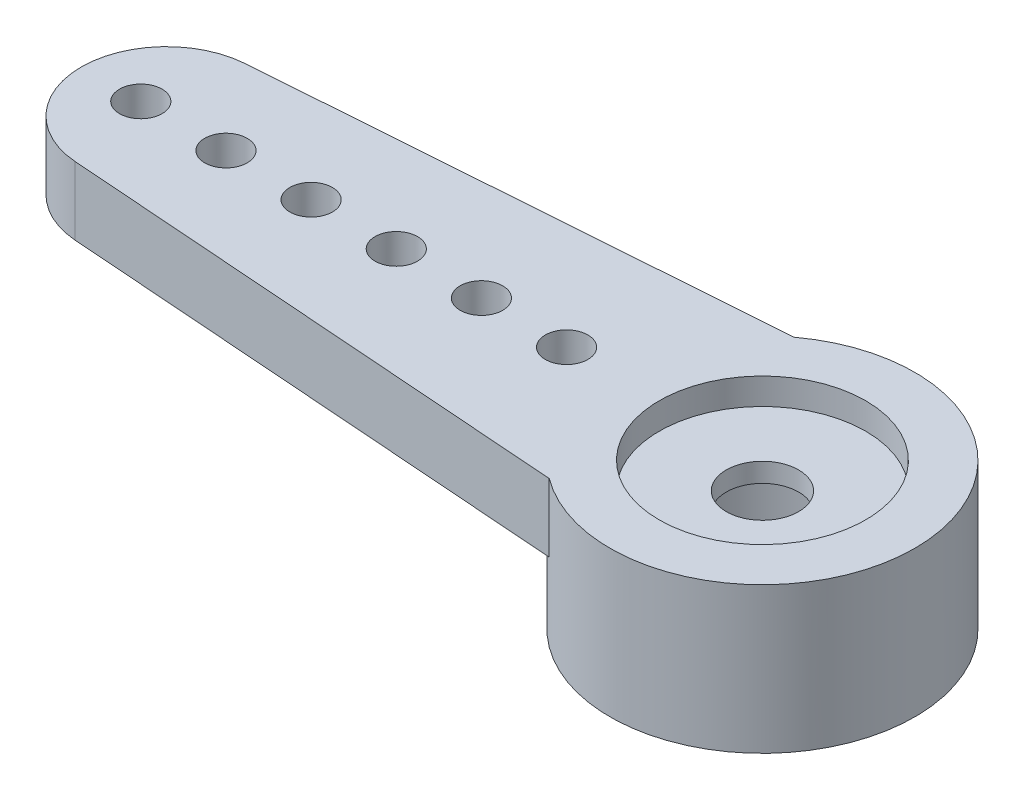
ISO-10303-21;
HEADER;
FILE_DESCRIPTION(('STEP AP214'),'2;1');
FILE_NAME('part.step','',(''),(''),'','','');
FILE_SCHEMA(('AUTOMOTIVE_DESIGN { 1 0 10303 214 1 1 1 1 }'));
ENDSEC;
DATA;
#1=APPLICATION_CONTEXT('core data for automotive mechanical design processes');
#2=APPLICATION_PROTOCOL_DEFINITION('international standard','automotive_design',2000,#1);
#3=PRODUCT_CONTEXT('',#1,'mechanical');
#4=PRODUCT('Part','Part','',(#3));
#5=PRODUCT_RELATED_PRODUCT_CATEGORY('part','',(#4));
#6=PRODUCT_DEFINITION_FORMATION('','',#4);
#7=PRODUCT_DEFINITION_CONTEXT('part definition',#1,'design');
#8=PRODUCT_DEFINITION('design','',#6,#7);
#9=PRODUCT_DEFINITION_SHAPE('','',#8);
#10=(LENGTH_UNIT() NAMED_UNIT(*) SI_UNIT(.MILLI.,.METRE.));
#11=(NAMED_UNIT(*) PLANE_ANGLE_UNIT() SI_UNIT($,.RADIAN.));
#12=(NAMED_UNIT(*) SI_UNIT($,.STERADIAN.) SOLID_ANGLE_UNIT());
#13=UNCERTAINTY_MEASURE_WITH_UNIT(LENGTH_MEASURE(1.E-05),#10,'distance_accuracy_value','');
#14=(GEOMETRIC_REPRESENTATION_CONTEXT(3) GLOBAL_UNCERTAINTY_ASSIGNED_CONTEXT((#13)) GLOBAL_UNIT_ASSIGNED_CONTEXT((#10,
#11,#12)) REPRESENTATION_CONTEXT('',''));
#15=CARTESIAN_POINT('',(0.,0.,0.));
#16=DIRECTION('',(0.,0.,1.));
#17=DIRECTION('',(1.,0.,0.));
#18=AXIS2_PLACEMENT_3D('',#15,#16,#17);
#19=CARTESIAN_POINT('',(5.9,12.67,-5.9));
#20=DIRECTION('',(0.,1.,0.));
#21=DIRECTION('',(0.,0.,1.));
#22=AXIS2_PLACEMENT_3D('',#19,#20,#21);
#23=PLANE('',#22);
#24=CARTESIAN_POINT('',(-2.7,12.67,-5.9));
#25=DIRECTION('',(0.,-1.,0.));
#26=DIRECTION('',(0.,0.,-1.));
#27=AXIS2_PLACEMENT_3D('',#24,#25,#26);
#28=CIRCLE('',#27,0.499999999999988);
#29=CARTESIAN_POINT('',(-2.7,12.67,-6.39999999999999));
#30=VERTEX_POINT('',#29);
#31=EDGE_CURVE('E182',#30,#30,#28,.T.);
#32=ORIENTED_EDGE('',*,*,#31,.F.);
#33=EDGE_LOOP('',(#32));
#34=FACE_BOUND('',#33,.T.);
#35=CARTESIAN_POINT('',(-6.7,12.67,-5.9));
#36=DIRECTION('',(0.,-1.,0.));
#37=DIRECTION('',(0.,0.,-1.));
#38=AXIS2_PLACEMENT_3D('',#35,#36,#37);
#39=CIRCLE('',#38,0.499999999999988);
#40=CARTESIAN_POINT('',(-6.7,12.67,-6.39999999999999));
#41=VERTEX_POINT('',#40);
#42=EDGE_CURVE('E178',#41,#41,#39,.T.);
#43=ORIENTED_EDGE('',*,*,#42,.F.);
#44=EDGE_LOOP('',(#43));
#45=FACE_BOUND('',#44,.T.);
#46=CARTESIAN_POINT('',(-8.7,12.67,-5.9));
#47=DIRECTION('',(0.,-1.,0.));
#48=DIRECTION('',(0.,0.,-1.));
#49=AXIS2_PLACEMENT_3D('',#46,#47,#48);
#50=CIRCLE('',#49,0.499999999999988);
#51=CARTESIAN_POINT('',(-8.7,12.67,-6.39999999999999));
#52=VERTEX_POINT('',#51);
#53=EDGE_CURVE('E174',#52,#52,#50,.T.);
#54=ORIENTED_EDGE('',*,*,#53,.F.);
#55=EDGE_LOOP('',(#54));
#56=FACE_BOUND('',#55,.T.);
#57=CARTESIAN_POINT('',(-0.699999999999997,12.67,-5.9));
#58=DIRECTION('',(0.,-1.,0.));
#59=DIRECTION('',(0.,0.,-1.));
#60=AXIS2_PLACEMENT_3D('',#57,#58,#59);
#61=CIRCLE('',#60,0.499999999999988);
#62=CARTESIAN_POINT('',(-0.699999999999997,12.67,-6.39999999999999));
#63=VERTEX_POINT('',#62);
#64=EDGE_CURVE('E166',#63,#63,#61,.T.);
#65=ORIENTED_EDGE('',*,*,#64,.F.);
#66=EDGE_LOOP('',(#65));
#67=FACE_BOUND('',#66,.T.);
#68=CARTESIAN_POINT('',(1.3,12.67,-5.9));
#69=DIRECTION('',(0.,-1.,0.));
#70=DIRECTION('',(0.,0.,-1.));
#71=AXIS2_PLACEMENT_3D('',#68,#69,#70);
#72=CIRCLE('',#71,0.499999999999988);
#73=CARTESIAN_POINT('',(1.3,12.67,-6.39999999999999));
#74=VERTEX_POINT('',#73);
#75=EDGE_CURVE('E162',#74,#74,#72,.T.);
#76=ORIENTED_EDGE('',*,*,#75,.F.);
#77=EDGE_LOOP('',(#76));
#78=FACE_BOUND('',#77,.T.);
#79=CARTESIAN_POINT('',(5.9,12.67,-5.9));
#80=DIRECTION('',(0.,-1.,0.));
#81=DIRECTION('',(0.,0.,-1.));
#82=AXIS2_PLACEMENT_3D('',#79,#80,#81);
#83=CIRCLE('',#82,3.58);
#84=CARTESIAN_POINT('',(3.76674544416284,12.67,-3.025));
#85=VERTEX_POINT('',#84);
#86=CARTESIAN_POINT('',(3.76674544416284,12.67,-8.775));
#87=VERTEX_POINT('',#86);
#88=EDGE_CURVE('E11',#85,#87,#83,.T.);
#89=ORIENTED_EDGE('',*,*,#88,.F.);
#90=DIRECTION('',(0.997325531387097,0.,0.0730875122264068));
#91=VECTOR('',#90,1.);
#92=CARTESIAN_POINT('',(-8.24617502445281,12.67,-3.90534893722581));
#93=LINE('',#92,#91);
#94=CARTESIAN_POINT('',(-8.24617502445281,12.67,-3.90534893722581));
#95=VERTEX_POINT('',#94);
#96=EDGE_CURVE('E83',#95,#85,#93,.T.);
#97=ORIENTED_EDGE('',*,*,#96,.F.);
#98=CARTESIAN_POINT('',(-8.09999999999999,12.67,-5.9));
#99=DIRECTION('',(0.,1.,0.));
#100=DIRECTION('',(0.,0.,1.));
#101=AXIS2_PLACEMENT_3D('',#98,#99,#100);
#102=CIRCLE('',#101,2.);
#103=CARTESIAN_POINT('',(-8.24617502445281,12.67,-7.8946510627742));
#104=VERTEX_POINT('',#103);
#105=EDGE_CURVE('E89',#104,#95,#102,.T.);
#106=ORIENTED_EDGE('',*,*,#105,.F.);
#107=DIRECTION('',(-0.997325531387097,0.,0.0730875122264058));
#108=VECTOR('',#107,1.);
#109=CARTESIAN_POINT('',(3.76674544416284,12.67,-8.775));
#110=LINE('',#109,#108);
#111=EDGE_CURVE('E85',#87,#104,#110,.T.);
#112=ORIENTED_EDGE('',*,*,#111,.F.);
#113=EDGE_LOOP('',(#89,#97,#106,#112));
#114=FACE_BOUND('',#113,.T.);
#115=CARTESIAN_POINT('',(-4.7,12.67,-5.9));
#116=DIRECTION('',(0.,-1.,0.));
#117=DIRECTION('',(0.,0.,-1.));
#118=AXIS2_PLACEMENT_3D('',#115,#116,#117);
#119=CIRCLE('',#118,0.499999999999988);
#120=CARTESIAN_POINT('',(-4.7,12.67,-6.39999999999999));
#121=VERTEX_POINT('',#120);
#122=EDGE_CURVE('E170',#121,#121,#119,.T.);
#123=ORIENTED_EDGE('',*,*,#122,.F.);
#124=EDGE_LOOP('',(#123));
#125=FACE_BOUND('',#124,.T.);
#126=ADVANCED_FACE('F33',(#34,#45,#56,#67,#78,#114,#125),#23,.F.);
#127=CARTESIAN_POINT('',(-8.24617502445281,12.67,-3.90534893722581));
#128=DIRECTION('',(-0.0730875122264068,0.,0.997325531387097));
#129=DIRECTION('',(0.997325531387097,0.,0.0730875122264068));
#130=AXIS2_PLACEMENT_3D('',#127,#128,#129);
#131=PLANE('',#130);
#132=DIRECTION('',(0.997325531387097,0.,0.0730875122264068));
#133=VECTOR('',#132,1.);
#134=CARTESIAN_POINT('',(-8.24617502445281,14.27,-3.90534893722581));
#135=LINE('',#134,#133);
#136=CARTESIAN_POINT('',(-8.24617502445281,14.27,-3.90534893722581));
#137=VERTEX_POINT('',#136);
#138=CARTESIAN_POINT('',(3.76674544416284,14.27,-3.025));
#139=VERTEX_POINT('',#138);
#140=EDGE_CURVE('E102',#137,#139,#135,.T.);
#141=ORIENTED_EDGE('',*,*,#140,.F.);
#142=DIRECTION('',(0.,1.,0.));
#143=VECTOR('',#142,1.);
#144=CARTESIAN_POINT('',(-8.24617502445281,12.67,-3.90534893722581));
#145=LINE('',#144,#143);
#146=EDGE_CURVE('E52',#95,#137,#145,.T.);
#147=ORIENTED_EDGE('',*,*,#146,.F.);
#148=ORIENTED_EDGE('',*,*,#96,.T.);
#149=DIRECTION('',(0.,1.,0.));
#150=VECTOR('',#149,1.);
#151=CARTESIAN_POINT('',(3.76674544416284,12.67,-3.025));
#152=LINE('',#151,#150);
#153=EDGE_CURVE('E43',#85,#139,#152,.T.);
#154=ORIENTED_EDGE('',*,*,#153,.T.);
#155=EDGE_LOOP('',(#141,#147,#148,#154));
#156=FACE_BOUND('',#155,.T.);
#157=ADVANCED_FACE('F88',(#156),#131,.T.);
#158=CARTESIAN_POINT('',(-8.09999999999999,12.67,-5.9));
#159=DIRECTION('',(0.,1.,0.));
#160=DIRECTION('',(0.,0.,1.));
#161=AXIS2_PLACEMENT_3D('',#158,#159,#160);
#162=CYLINDRICAL_SURFACE('',#161,2.);
#163=CARTESIAN_POINT('',(-8.09999999999999,14.27,-5.9));
#164=DIRECTION('',(0.,1.,0.));
#165=DIRECTION('',(0.,0.,1.));
#166=AXIS2_PLACEMENT_3D('',#163,#164,#165);
#167=CIRCLE('',#166,2.);
#168=CARTESIAN_POINT('',(-8.24617502445281,14.27,-7.8946510627742));
#169=VERTEX_POINT('',#168);
#170=EDGE_CURVE('E100',#169,#137,#167,.T.);
#171=ORIENTED_EDGE('',*,*,#170,.F.);
#172=DIRECTION('',(0.,1.,0.));
#173=VECTOR('',#172,1.);
#174=CARTESIAN_POINT('',(-8.24617502445281,12.67,-7.8946510627742));
#175=LINE('',#174,#173);
#176=EDGE_CURVE('E91',#104,#169,#175,.T.);
#177=ORIENTED_EDGE('',*,*,#176,.F.);
#178=ORIENTED_EDGE('',*,*,#105,.T.);
#179=ORIENTED_EDGE('',*,*,#146,.T.);
#180=EDGE_LOOP('',(#171,#177,#178,#179));
#181=FACE_BOUND('',#180,.T.);
#182=ADVANCED_FACE('F107',(#181),#162,.T.);
#183=CARTESIAN_POINT('',(3.76674544416284,12.67,-8.775));
#184=DIRECTION('',(-0.0730875122264058,0.,-0.997325531387097));
#185=DIRECTION('',(-0.997325531387097,0.,0.0730875122264058));
#186=AXIS2_PLACEMENT_3D('',#183,#184,#185);
#187=PLANE('',#186);
#188=DIRECTION('',(-0.997325531387097,0.,0.0730875122264058));
#189=VECTOR('',#188,1.);
#190=CARTESIAN_POINT('',(3.76674544416284,14.27,-8.775));
#191=LINE('',#190,#189);
#192=CARTESIAN_POINT('',(3.76674544416284,14.27,-8.775));
#193=VERTEX_POINT('',#192);
#194=EDGE_CURVE('E96',#193,#169,#191,.T.);
#195=ORIENTED_EDGE('',*,*,#194,.F.);
#196=DIRECTION('',(0.,1.,0.));
#197=VECTOR('',#196,1.);
#198=CARTESIAN_POINT('',(3.76674544416284,12.67,-8.775));
#199=LINE('',#198,#197);
#200=EDGE_CURVE('E37',#87,#193,#199,.T.);
#201=ORIENTED_EDGE('',*,*,#200,.F.);
#202=ORIENTED_EDGE('',*,*,#111,.T.);
#203=ORIENTED_EDGE('',*,*,#176,.T.);
#204=EDGE_LOOP('',(#195,#201,#202,#203));
#205=FACE_BOUND('',#204,.T.);
#206=ADVANCED_FACE('F106',(#205),#187,.T.);
#207=CARTESIAN_POINT('',(5.9,12.67,-5.9));
#208=DIRECTION('',(0.,1.,0.));
#209=DIRECTION('',(0.,0.,1.));
#210=AXIS2_PLACEMENT_3D('',#207,#208,#209);
#211=CYLINDRICAL_SURFACE('',#210,3.58);
#212=CARTESIAN_POINT('',(5.9,10.84,-5.9));
#213=DIRECTION('',(0.,-1.,0.));
#214=DIRECTION('',(0.,0.,-1.));
#215=AXIS2_PLACEMENT_3D('',#212,#213,#214);
#216=CIRCLE('',#215,3.58);
#217=CARTESIAN_POINT('',(5.9,10.84,-9.48));
#218=VERTEX_POINT('',#217);
#219=EDGE_CURVE('E97',#218,#218,#216,.T.);
#220=ORIENTED_EDGE('',*,*,#219,.F.);
#221=EDGE_LOOP('',(#220));
#222=FACE_BOUND('',#221,.T.);
#223=CARTESIAN_POINT('',(5.9,14.27,-5.9));
#224=DIRECTION('',(0.,1.,0.));
#225=DIRECTION('',(0.,0.,1.));
#226=AXIS2_PLACEMENT_3D('',#223,#224,#225);
#227=CIRCLE('',#226,3.58);
#228=EDGE_CURVE('E73',#139,#193,#227,.T.);
#229=ORIENTED_EDGE('',*,*,#228,.F.);
#230=ORIENTED_EDGE('',*,*,#153,.F.);
#231=ORIENTED_EDGE('',*,*,#88,.T.);
#232=ORIENTED_EDGE('',*,*,#200,.T.);
#233=EDGE_LOOP('',(#229,#230,#231,#232));
#234=FACE_BOUND('',#233,.T.);
#235=ADVANCED_FACE('F35',(#222,#234),#211,.T.);
#236=CARTESIAN_POINT('',(5.9,14.27,-5.9));
#237=DIRECTION('',(0.,1.,0.));
#238=DIRECTION('',(0.,0.,1.));
#239=AXIS2_PLACEMENT_3D('',#236,#237,#238);
#240=PLANE('',#239);
#241=ORIENTED_EDGE('',*,*,#140,.T.);
#242=ORIENTED_EDGE('',*,*,#228,.T.);
#243=ORIENTED_EDGE('',*,*,#194,.T.);
#244=ORIENTED_EDGE('',*,*,#170,.T.);
#245=EDGE_LOOP('',(#241,#242,#243,#244));
#246=FACE_BOUND('',#245,.T.);
#247=CARTESIAN_POINT('',(-2.7,14.27,-5.9));
#248=DIRECTION('',(0.,-1.,0.));
#249=DIRECTION('',(0.,0.,-1.));
#250=AXIS2_PLACEMENT_3D('',#247,#248,#249);
#251=CIRCLE('',#250,0.499999999999988);
#252=CARTESIAN_POINT('',(-2.7,14.27,-6.39999999999999));
#253=VERTEX_POINT('',#252);
#254=EDGE_CURVE('E117',#253,#253,#251,.T.);
#255=ORIENTED_EDGE('',*,*,#254,.T.);
#256=EDGE_LOOP('',(#255));
#257=FACE_BOUND('',#256,.T.);
#258=CARTESIAN_POINT('',(-6.7,14.27,-5.9));
#259=DIRECTION('',(0.,-1.,0.));
#260=DIRECTION('',(0.,0.,-1.));
#261=AXIS2_PLACEMENT_3D('',#258,#259,#260);
#262=CIRCLE('',#261,0.499999999999987);
#263=CARTESIAN_POINT('',(-6.7,14.27,-6.39999999999999));
#264=VERTEX_POINT('',#263);
#265=EDGE_CURVE('E121',#264,#264,#262,.T.);
#266=ORIENTED_EDGE('',*,*,#265,.T.);
#267=EDGE_LOOP('',(#266));
#268=FACE_BOUND('',#267,.T.);
#269=CARTESIAN_POINT('',(-8.7,14.27,-5.9));
#270=DIRECTION('',(0.,-1.,0.));
#271=DIRECTION('',(0.,0.,-1.));
#272=AXIS2_PLACEMENT_3D('',#269,#270,#271);
#273=CIRCLE('',#272,0.499999999999988);
#274=CARTESIAN_POINT('',(-8.7,14.27,-6.39999999999999));
#275=VERTEX_POINT('',#274);
#276=EDGE_CURVE('E125',#275,#275,#273,.T.);
#277=ORIENTED_EDGE('',*,*,#276,.T.);
#278=EDGE_LOOP('',(#277));
#279=FACE_BOUND('',#278,.T.);
#280=CARTESIAN_POINT('',(-4.7,14.27,-5.9));
#281=DIRECTION('',(0.,-1.,0.));
#282=DIRECTION('',(0.,0.,-1.));
#283=AXIS2_PLACEMENT_3D('',#280,#281,#282);
#284=CIRCLE('',#283,0.499999999999987);
#285=CARTESIAN_POINT('',(-4.7,14.27,-6.39999999999999));
#286=VERTEX_POINT('',#285);
#287=EDGE_CURVE('E129',#286,#286,#284,.T.);
#288=ORIENTED_EDGE('',*,*,#287,.T.);
#289=EDGE_LOOP('',(#288));
#290=FACE_BOUND('',#289,.T.);
#291=CARTESIAN_POINT('',(-0.699999999999997,14.27,-5.9));
#292=DIRECTION('',(0.,-1.,0.));
#293=DIRECTION('',(0.,0.,-1.));
#294=AXIS2_PLACEMENT_3D('',#291,#292,#293);
#295=CIRCLE('',#294,0.499999999999988);
#296=CARTESIAN_POINT('',(-0.699999999999997,14.27,-6.39999999999999));
#297=VERTEX_POINT('',#296);
#298=EDGE_CURVE('E133',#297,#297,#295,.T.);
#299=ORIENTED_EDGE('',*,*,#298,.T.);
#300=EDGE_LOOP('',(#299));
#301=FACE_BOUND('',#300,.T.);
#302=CARTESIAN_POINT('',(1.3,14.27,-5.9));
#303=DIRECTION('',(0.,-1.,0.));
#304=DIRECTION('',(0.,0.,-1.));
#305=AXIS2_PLACEMENT_3D('',#302,#303,#304);
#306=CIRCLE('',#305,0.499999999999988);
#307=CARTESIAN_POINT('',(1.3,14.27,-6.39999999999999));
#308=VERTEX_POINT('',#307);
#309=EDGE_CURVE('E137',#308,#308,#306,.T.);
#310=ORIENTED_EDGE('',*,*,#309,.T.);
#311=EDGE_LOOP('',(#310));
#312=FACE_BOUND('',#311,.T.);
#313=CARTESIAN_POINT('',(5.9,14.27,-5.9));
#314=DIRECTION('',(0.,-1.,0.));
#315=DIRECTION('',(0.,0.,-1.));
#316=AXIS2_PLACEMENT_3D('',#313,#314,#315);
#317=CIRCLE('',#316,2.425);
#318=CARTESIAN_POINT('',(5.9,14.27,-8.325));
#319=VERTEX_POINT('',#318);
#320=EDGE_CURVE('E140',#319,#319,#317,.T.);
#321=ORIENTED_EDGE('',*,*,#320,.T.);
#322=EDGE_LOOP('',(#321));
#323=FACE_BOUND('',#322,.T.);
#324=ADVANCED_FACE('F109',(#246,#257,#268,#279,#290,#301,#312,#323),#240,.T.);
#325=CARTESIAN_POINT('',(5.9,10.84,-5.9));
#326=DIRECTION('',(0.,-1.,0.));
#327=DIRECTION('',(0.,0.,-1.));
#328=AXIS2_PLACEMENT_3D('',#325,#326,#327);
#329=PLANE('',#328);
#330=CARTESIAN_POINT('',(5.9,10.84,-5.9));
#331=DIRECTION('',(0.,-1.,0.));
#332=DIRECTION('',(0.,0.,-1.));
#333=AXIS2_PLACEMENT_3D('',#330,#331,#332);
#334=CIRCLE('',#333,2.3);
#335=CARTESIAN_POINT('',(5.9,10.84,-8.2));
#336=VERTEX_POINT('',#335);
#337=EDGE_CURVE('E142',#336,#336,#334,.T.);
#338=ORIENTED_EDGE('',*,*,#337,.F.);
#339=EDGE_LOOP('',(#338));
#340=FACE_BOUND('',#339,.T.);
#341=ORIENTED_EDGE('',*,*,#219,.T.);
#342=EDGE_LOOP('',(#341));
#343=FACE_BOUND('',#342,.T.);
#344=ADVANCED_FACE('F112',(#340,#343),#329,.T.);
#345=CARTESIAN_POINT('',(5.9,14.27,-5.9));
#346=DIRECTION('',(0.,-1.,0.));
#347=DIRECTION('',(0.,0.,-1.));
#348=AXIS2_PLACEMENT_3D('',#345,#346,#347);
#349=CYLINDRICAL_SURFACE('',#348,2.425);
#350=ORIENTED_EDGE('',*,*,#320,.F.);
#351=EDGE_LOOP('',(#350));
#352=FACE_BOUND('',#351,.T.);
#353=CARTESIAN_POINT('',(5.9,13.65,-5.9));
#354=DIRECTION('',(0.,-1.,0.));
#355=DIRECTION('',(0.,0.,-1.));
#356=AXIS2_PLACEMENT_3D('',#353,#354,#355);
#357=CIRCLE('',#356,2.425);
#358=CARTESIAN_POINT('',(5.9,13.65,-8.325));
#359=VERTEX_POINT('',#358);
#360=EDGE_CURVE('E158',#359,#359,#357,.T.);
#361=ORIENTED_EDGE('',*,*,#360,.T.);
#362=EDGE_LOOP('',(#361));
#363=FACE_BOUND('',#362,.T.);
#364=ADVANCED_FACE('F227',(#352,#363),#349,.F.);
#365=CARTESIAN_POINT('',(5.9,14.27,-5.9));
#366=DIRECTION('',(0.,-1.,0.));
#367=DIRECTION('',(0.,0.,-1.));
#368=AXIS2_PLACEMENT_3D('',#365,#366,#367);
#369=CYLINDRICAL_SURFACE('',#368,2.3);
#370=CARTESIAN_POINT('',(5.9,13.2,-5.9));
#371=DIRECTION('',(0.,-1.,0.));
#372=DIRECTION('',(0.,0.,-1.));
#373=AXIS2_PLACEMENT_3D('',#370,#371,#372);
#374=CIRCLE('',#373,2.3);
#375=CARTESIAN_POINT('',(5.9,13.2,-8.2));
#376=VERTEX_POINT('',#375);
#377=EDGE_CURVE('E147',#376,#376,#374,.T.);
#378=ORIENTED_EDGE('',*,*,#377,.F.);
#379=EDGE_LOOP('',(#378));
#380=FACE_BOUND('',#379,.T.);
#381=ORIENTED_EDGE('',*,*,#337,.T.);
#382=EDGE_LOOP('',(#381));
#383=FACE_BOUND('',#382,.T.);
#384=ADVANCED_FACE('F223',(#380,#383),#369,.F.);
#385=CARTESIAN_POINT('',(8.2,13.2,-5.9));
#386=DIRECTION('',(0.,1.,0.));
#387=DIRECTION('',(0.,0.,1.));
#388=AXIS2_PLACEMENT_3D('',#385,#386,#387);
#389=PLANE('',#388);
#390=CARTESIAN_POINT('',(5.9,13.2,-5.9));
#391=DIRECTION('',(0.,-1.,0.));
#392=DIRECTION('',(0.,0.,-1.));
#393=AXIS2_PLACEMENT_3D('',#390,#391,#392);
#394=CIRCLE('',#393,0.850000000000001);
#395=CARTESIAN_POINT('',(5.9,13.2,-6.75));
#396=VERTEX_POINT('',#395);
#397=EDGE_CURVE('E152',#396,#396,#394,.T.);
#398=ORIENTED_EDGE('',*,*,#397,.F.);
#399=EDGE_LOOP('',(#398));
#400=FACE_BOUND('',#399,.T.);
#401=ORIENTED_EDGE('',*,*,#377,.T.);
#402=EDGE_LOOP('',(#401));
#403=FACE_BOUND('',#402,.T.);
#404=ADVANCED_FACE('F219',(#400,#403),#389,.F.);
#405=CARTESIAN_POINT('',(5.9,14.27,-5.9));
#406=DIRECTION('',(0.,-1.,0.));
#407=DIRECTION('',(0.,0.,-1.));
#408=AXIS2_PLACEMENT_3D('',#405,#406,#407);
#409=CYLINDRICAL_SURFACE('',#408,0.850000000000001);
#410=CARTESIAN_POINT('',(5.9,13.65,-5.9));
#411=DIRECTION('',(0.,-1.,0.));
#412=DIRECTION('',(0.,0.,-1.));
#413=AXIS2_PLACEMENT_3D('',#410,#411,#412);
#414=CIRCLE('',#413,0.850000000000001);
#415=CARTESIAN_POINT('',(5.9,13.65,-6.75));
#416=VERTEX_POINT('',#415);
#417=EDGE_CURVE('E155',#416,#416,#414,.T.);
#418=ORIENTED_EDGE('',*,*,#417,.F.);
#419=EDGE_LOOP('',(#418));
#420=FACE_BOUND('',#419,.T.);
#421=ORIENTED_EDGE('',*,*,#397,.T.);
#422=EDGE_LOOP('',(#421));
#423=FACE_BOUND('',#422,.T.);
#424=ADVANCED_FACE('F212',(#420,#423),#409,.F.);
#425=CARTESIAN_POINT('',(6.75,13.65,-5.9));
#426=DIRECTION('',(0.,-1.,0.));
#427=DIRECTION('',(0.,0.,-1.));
#428=AXIS2_PLACEMENT_3D('',#425,#426,#427);
#429=PLANE('',#428);
#430=ORIENTED_EDGE('',*,*,#360,.F.);
#431=EDGE_LOOP('',(#430));
#432=FACE_BOUND('',#431,.T.);
#433=ORIENTED_EDGE('',*,*,#417,.T.);
#434=EDGE_LOOP('',(#433));
#435=FACE_BOUND('',#434,.T.);
#436=ADVANCED_FACE('F202',(#432,#435),#429,.F.);
#437=CARTESIAN_POINT('',(1.3,12.67,-5.9));
#438=DIRECTION('',(0.,-1.,0.));
#439=DIRECTION('',(0.,0.,-1.));
#440=AXIS2_PLACEMENT_3D('',#437,#438,#439);
#441=CYLINDRICAL_SURFACE('',#440,0.499999999999988);
#442=ORIENTED_EDGE('',*,*,#309,.F.);
#443=EDGE_LOOP('',(#442));
#444=FACE_BOUND('',#443,.T.);
#445=ORIENTED_EDGE('',*,*,#75,.T.);
#446=EDGE_LOOP('',(#445));
#447=FACE_BOUND('',#446,.T.);
#448=ADVANCED_FACE('F199',(#444,#447),#441,.F.);
#449=CARTESIAN_POINT('',(-0.699999999999997,12.67,-5.9));
#450=DIRECTION('',(0.,-1.,0.));
#451=DIRECTION('',(0.,0.,-1.));
#452=AXIS2_PLACEMENT_3D('',#449,#450,#451);
#453=CYLINDRICAL_SURFACE('',#452,0.499999999999988);
#454=ORIENTED_EDGE('',*,*,#298,.F.);
#455=EDGE_LOOP('',(#454));
#456=FACE_BOUND('',#455,.T.);
#457=ORIENTED_EDGE('',*,*,#64,.T.);
#458=EDGE_LOOP('',(#457));
#459=FACE_BOUND('',#458,.T.);
#460=ADVANCED_FACE('F201',(#456,#459),#453,.F.);
#461=CARTESIAN_POINT('',(-4.7,12.67,-5.9));
#462=DIRECTION('',(0.,-1.,0.));
#463=DIRECTION('',(0.,0.,-1.));
#464=AXIS2_PLACEMENT_3D('',#461,#462,#463);
#465=CYLINDRICAL_SURFACE('',#464,0.499999999999988);
#466=ORIENTED_EDGE('',*,*,#287,.F.);
#467=EDGE_LOOP('',(#466));
#468=FACE_BOUND('',#467,.T.);
#469=ORIENTED_EDGE('',*,*,#122,.T.);
#470=EDGE_LOOP('',(#469));
#471=FACE_BOUND('',#470,.T.);
#472=ADVANCED_FACE('F209',(#468,#471),#465,.F.);
#473=CARTESIAN_POINT('',(-8.7,12.67,-5.9));
#474=DIRECTION('',(0.,-1.,0.));
#475=DIRECTION('',(0.,0.,-1.));
#476=AXIS2_PLACEMENT_3D('',#473,#474,#475);
#477=CYLINDRICAL_SURFACE('',#476,0.499999999999988);
#478=ORIENTED_EDGE('',*,*,#276,.F.);
#479=EDGE_LOOP('',(#478));
#480=FACE_BOUND('',#479,.T.);
#481=ORIENTED_EDGE('',*,*,#53,.T.);
#482=EDGE_LOOP('',(#481));
#483=FACE_BOUND('',#482,.T.);
#484=ADVANCED_FACE('F261',(#480,#483),#477,.F.);
#485=CARTESIAN_POINT('',(-6.7,12.67,-5.9));
#486=DIRECTION('',(0.,-1.,0.));
#487=DIRECTION('',(0.,0.,-1.));
#488=AXIS2_PLACEMENT_3D('',#485,#486,#487);
#489=CYLINDRICAL_SURFACE('',#488,0.499999999999988);
#490=ORIENTED_EDGE('',*,*,#265,.F.);
#491=EDGE_LOOP('',(#490));
#492=FACE_BOUND('',#491,.T.);
#493=ORIENTED_EDGE('',*,*,#42,.T.);
#494=EDGE_LOOP('',(#493));
#495=FACE_BOUND('',#494,.T.);
#496=ADVANCED_FACE('F253',(#492,#495),#489,.F.);
#497=CARTESIAN_POINT('',(-2.7,12.67,-5.9));
#498=DIRECTION('',(0.,-1.,0.));
#499=DIRECTION('',(0.,0.,-1.));
#500=AXIS2_PLACEMENT_3D('',#497,#498,#499);
#501=CYLINDRICAL_SURFACE('',#500,0.499999999999988);
#502=ORIENTED_EDGE('',*,*,#254,.F.);
#503=EDGE_LOOP('',(#502));
#504=FACE_BOUND('',#503,.T.);
#505=ORIENTED_EDGE('',*,*,#31,.T.);
#506=EDGE_LOOP('',(#505));
#507=FACE_BOUND('',#506,.T.);
#508=ADVANCED_FACE('F186',(#504,#507),#501,.F.);
#509=CLOSED_SHELL('',(#126,#157,#182,#206,#235,#324,#344,#364,#384,#404,#424,#436,#448,#460,
#472,#484,#496,#508));
#510=MANIFOLD_SOLID_BREP('B2',#509);
#511=ADVANCED_BREP_SHAPE_REPRESENTATION('',(#18,#510),#14);
#512=SHAPE_DEFINITION_REPRESENTATION(#9,#511);
ENDSEC;
END-ISO-10303-21;
